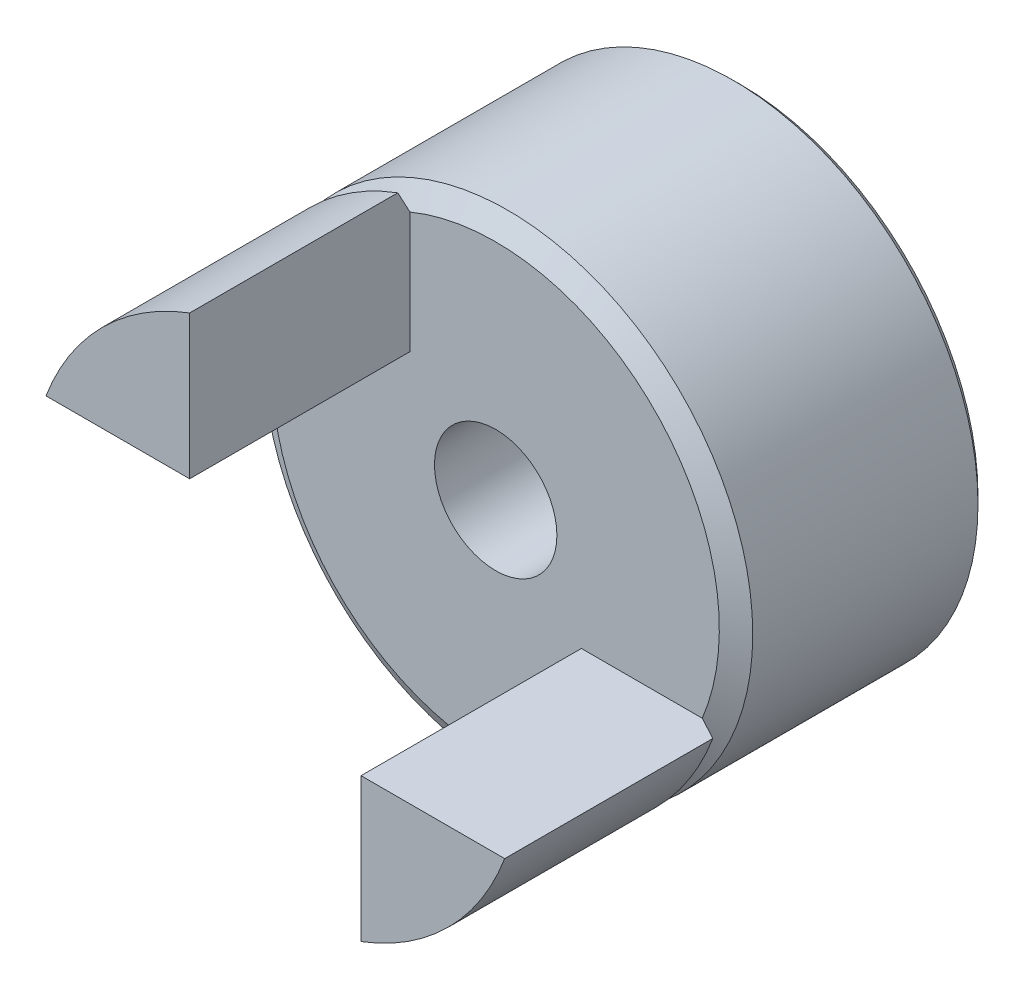
ISO-10303-21;
HEADER;
FILE_DESCRIPTION(('STEP AP214'),'2;1');
FILE_NAME('part.step','',(''),(''),'','','');
FILE_SCHEMA(('AUTOMOTIVE_DESIGN { 1 0 10303 214 1 1 1 1 }'));
ENDSEC;
DATA;
#1=APPLICATION_CONTEXT('core data for automotive mechanical design processes');
#2=APPLICATION_PROTOCOL_DEFINITION('international standard','automotive_design',2000,#1);
#3=PRODUCT_CONTEXT('',#1,'mechanical');
#4=PRODUCT('Part','Part','',(#3));
#5=PRODUCT_RELATED_PRODUCT_CATEGORY('part','',(#4));
#6=PRODUCT_DEFINITION_FORMATION('','',#4);
#7=PRODUCT_DEFINITION_CONTEXT('part definition',#1,'design');
#8=PRODUCT_DEFINITION('design','',#6,#7);
#9=PRODUCT_DEFINITION_SHAPE('','',#8);
#10=(LENGTH_UNIT() NAMED_UNIT(*) SI_UNIT(.MILLI.,.METRE.));
#11=(NAMED_UNIT(*) PLANE_ANGLE_UNIT() SI_UNIT($,.RADIAN.));
#12=(NAMED_UNIT(*) SI_UNIT($,.STERADIAN.) SOLID_ANGLE_UNIT());
#13=UNCERTAINTY_MEASURE_WITH_UNIT(LENGTH_MEASURE(1.E-05),#10,'distance_accuracy_value','');
#14=(GEOMETRIC_REPRESENTATION_CONTEXT(3) GLOBAL_UNCERTAINTY_ASSIGNED_CONTEXT((#13)) GLOBAL_UNIT_ASSIGNED_CONTEXT((#10,
#11,#12)) REPRESENTATION_CONTEXT('',''));
#15=CARTESIAN_POINT('',(0.,0.,0.));
#16=DIRECTION('',(0.,0.,1.));
#17=DIRECTION('',(1.,0.,0.));
#18=AXIS2_PLACEMENT_3D('',#15,#16,#17);
#19=CARTESIAN_POINT('',(0.,0.,10.));
#20=DIRECTION('',(0.,0.,1.));
#21=DIRECTION('',(1.,0.,0.));
#22=AXIS2_PLACEMENT_3D('',#19,#20,#21);
#23=PLANE('',#22);
#24=CARTESIAN_POINT('',(0.,0.,10.));
#25=DIRECTION('',(0.,0.,1.));
#26=DIRECTION('',(1.,0.,0.));
#27=AXIS2_PLACEMENT_3D('',#24,#25,#26);
#28=CIRCLE('',#27,2.5);
#29=CARTESIAN_POINT('',(2.5,0.,10.));
#30=VERTEX_POINT('',#29);
#31=EDGE_CURVE('E219',#30,#30,#28,.T.);
#32=ORIENTED_EDGE('',*,*,#31,.F.);
#33=EDGE_LOOP('',(#32));
#34=FACE_BOUND('',#33,.T.);
#35=DIRECTION('',(1.,0.,0.));
#36=VECTOR('',#35,1.);
#37=CARTESIAN_POINT('',(0.,3.5,10.));
#38=LINE('',#37,#36);
#39=CARTESIAN_POINT('',(-8.43679393634283,3.5,10.));
#40=VERTEX_POINT('',#39);
#41=CARTESIAN_POINT('',(-3.5,3.5,10.));
#42=VERTEX_POINT('',#41);
#43=EDGE_CURVE('E38',#40,#42,#38,.T.);
#44=ORIENTED_EDGE('',*,*,#43,.F.);
#45=CARTESIAN_POINT('',(0.,0.,10.));
#46=DIRECTION('',(0.,0.,-1.));
#47=DIRECTION('',(-1.,0.,0.));
#48=AXIS2_PLACEMENT_3D('',#45,#46,#47);
#49=CIRCLE('',#48,9.13397459621556);
#50=CARTESIAN_POINT('',(3.5,-8.43679393634283,10.));
#51=VERTEX_POINT('',#50);
#52=EDGE_CURVE('E125',#51,#40,#49,.T.);
#53=ORIENTED_EDGE('',*,*,#52,.F.);
#54=DIRECTION('',(0.,1.,0.));
#55=VECTOR('',#54,1.);
#56=CARTESIAN_POINT('',(3.5,0.,10.));
#57=LINE('',#56,#55);
#58=CARTESIAN_POINT('',(3.5,-3.5,10.));
#59=VERTEX_POINT('',#58);
#60=EDGE_CURVE('E59',#51,#59,#57,.T.);
#61=ORIENTED_EDGE('',*,*,#60,.T.);
#62=DIRECTION('',(1.,0.,0.));
#63=VECTOR('',#62,1.);
#64=CARTESIAN_POINT('',(0.,-3.5,10.));
#65=LINE('',#64,#63);
#66=CARTESIAN_POINT('',(8.43679393634283,-3.5,10.));
#67=VERTEX_POINT('',#66);
#68=EDGE_CURVE('E251',#59,#67,#65,.T.);
#69=ORIENTED_EDGE('',*,*,#68,.T.);
#70=CARTESIAN_POINT('',(-3.5,8.43679393634283,10.));
#71=VERTEX_POINT('',#70);
#72=EDGE_CURVE('E51',#71,#67,#49,.T.);
#73=ORIENTED_EDGE('',*,*,#72,.F.);
#74=DIRECTION('',(0.,1.,0.));
#75=VECTOR('',#74,1.);
#76=CARTESIAN_POINT('',(-3.5,0.,10.));
#77=LINE('',#76,#75);
#78=EDGE_CURVE('E225',#42,#71,#77,.T.);
#79=ORIENTED_EDGE('',*,*,#78,.F.);
#80=EDGE_LOOP('',(#44,#53,#61,#69,#73,#79));
#81=FACE_BOUND('',#80,.T.);
#82=ADVANCED_FACE('F34',(#34,#81),#23,.T.);
#83=CARTESIAN_POINT('',(0.,0.,10.));
#84=DIRECTION('',(0.,0.,-1.));
#85=DIRECTION('',(-1.,0.,0.));
#86=AXIS2_PLACEMENT_3D('',#83,#84,#85);
#87=CYLINDRICAL_SURFACE('',#86,10.);
#88=CARTESIAN_POINT('',(0.,0.,0.299999999999995));
#89=DIRECTION('',(0.,0.,1.));
#90=DIRECTION('',(1.,0.,0.));
#91=AXIS2_PLACEMENT_3D('',#88,#89,#90);
#92=CIRCLE('',#91,10.);
#93=CARTESIAN_POINT('',(10.,0.,0.299999999999995));
#94=VERTEX_POINT('',#93);
#95=EDGE_CURVE('E44',#94,#94,#92,.T.);
#96=ORIENTED_EDGE('',*,*,#95,.T.);
#97=EDGE_LOOP('',(#96));
#98=FACE_BOUND('',#97,.T.);
#99=CARTESIAN_POINT('',(0.,0.,9.5));
#100=DIRECTION('',(0.,0.,-1.));
#101=DIRECTION('',(-1.,0.,0.));
#102=AXIS2_PLACEMENT_3D('',#99,#100,#101);
#103=CIRCLE('',#102,10.);
#104=CARTESIAN_POINT('',(-10.,0.,9.5));
#105=VERTEX_POINT('',#104);
#106=EDGE_CURVE('E254',#105,#105,#103,.T.);
#107=ORIENTED_EDGE('',*,*,#106,.T.);
#108=EDGE_LOOP('',(#107));
#109=FACE_BOUND('',#108,.T.);
#110=ADVANCED_FACE('F194',(#98,#109),#87,.T.);
#111=CARTESIAN_POINT('',(0.,0.,10.5));
#112=DIRECTION('',(0.,0.,-1.));
#113=DIRECTION('',(-1.,0.,0.));
#114=AXIS2_PLACEMENT_3D('',#111,#112,#113);
#115=CIRCLE('',#114,10.);
#116=CARTESIAN_POINT('',(9.3674969975976,-3.5,10.5));
#117=VERTEX_POINT('',#116);
#118=CARTESIAN_POINT('',(3.5,-9.3674969975976,10.5));
#119=VERTEX_POINT('',#118);
#120=EDGE_CURVE('E126',#117,#119,#115,.T.);
#121=ORIENTED_EDGE('',*,*,#120,.F.);
#122=DIRECTION('',(0.,0.,-1.));
#123=VECTOR('',#122,1.);
#124=CARTESIAN_POINT('',(9.3674969975976,-3.5,19.));
#125=LINE('',#124,#123);
#126=CARTESIAN_POINT('',(9.3674969975976,-3.5,19.));
#127=VERTEX_POINT('',#126);
#128=EDGE_CURVE('E238',#127,#117,#125,.T.);
#129=ORIENTED_EDGE('',*,*,#128,.F.);
#130=CARTESIAN_POINT('',(0.,0.,19.));
#131=DIRECTION('',(0.,0.,1.));
#132=DIRECTION('',(1.,0.,0.));
#133=AXIS2_PLACEMENT_3D('',#130,#131,#132);
#134=CIRCLE('',#133,10.);
#135=CARTESIAN_POINT('',(3.5,-9.3674969975976,19.));
#136=VERTEX_POINT('',#135);
#137=EDGE_CURVE('E269',#136,#127,#134,.T.);
#138=ORIENTED_EDGE('',*,*,#137,.F.);
#139=DIRECTION('',(0.,0.,-1.));
#140=VECTOR('',#139,1.);
#141=CARTESIAN_POINT('',(3.5,-9.3674969975976,19.));
#142=LINE('',#141,#140);
#143=EDGE_CURVE('E236',#136,#119,#142,.T.);
#144=ORIENTED_EDGE('',*,*,#143,.T.);
#145=EDGE_LOOP('',(#121,#129,#138,#144));
#146=FACE_BOUND('',#145,.T.);
#147=ADVANCED_FACE('F200',(#146),#87,.T.);
#148=CARTESIAN_POINT('',(-9.3674969975976,3.5,10.5));
#149=VERTEX_POINT('',#148);
#150=CARTESIAN_POINT('',(-3.5,9.36749699759759,10.5));
#151=VERTEX_POINT('',#150);
#152=EDGE_CURVE('E108',#149,#151,#115,.T.);
#153=ORIENTED_EDGE('',*,*,#152,.F.);
#154=DIRECTION('',(0.,0.,-1.));
#155=VECTOR('',#154,1.);
#156=CARTESIAN_POINT('',(-9.3674969975976,3.5,19.));
#157=LINE('',#156,#155);
#158=CARTESIAN_POINT('',(-9.3674969975976,3.5,19.));
#159=VERTEX_POINT('',#158);
#160=EDGE_CURVE('E121',#159,#149,#157,.T.);
#161=ORIENTED_EDGE('',*,*,#160,.F.);
#162=CARTESIAN_POINT('',(0.,0.,19.));
#163=DIRECTION('',(0.,0.,1.));
#164=DIRECTION('',(1.,0.,0.));
#165=AXIS2_PLACEMENT_3D('',#162,#163,#164);
#166=CIRCLE('',#165,10.);
#167=CARTESIAN_POINT('',(-3.5,9.3674969975976,19.));
#168=VERTEX_POINT('',#167);
#169=EDGE_CURVE('E132',#168,#159,#166,.T.);
#170=ORIENTED_EDGE('',*,*,#169,.F.);
#171=DIRECTION('',(0.,0.,-1.));
#172=VECTOR('',#171,1.);
#173=CARTESIAN_POINT('',(-3.5,9.3674969975976,19.));
#174=LINE('',#173,#172);
#175=EDGE_CURVE('E124',#168,#151,#174,.T.);
#176=ORIENTED_EDGE('',*,*,#175,.T.);
#177=EDGE_LOOP('',(#153,#161,#170,#176));
#178=FACE_BOUND('',#177,.T.);
#179=ADVANCED_FACE('F119',(#178),#87,.T.);
#180=CARTESIAN_POINT('',(0.,3.5,19.));
#181=DIRECTION('',(0.,1.,0.));
#182=DIRECTION('',(0.,0.,1.));
#183=AXIS2_PLACEMENT_3D('',#180,#181,#182);
#184=PLANE('',#183);
#185=CARTESIAN_POINT('',(0.0335271971686652,3.5,6.74731596011501));
#186=CARTESIAN_POINT('',(-0.0668375018208296,3.5,6.74673409774683));
#187=CARTESIAN_POINT('',(-0.167208233798262,3.5,6.74869724875467));
#188=CARTESIAN_POINT('',(-0.367696321437432,3.5,6.75753158287431));
#189=CARTESIAN_POINT('',(-0.467813759446565,3.5,6.76440088515545));
#190=CARTESIAN_POINT('',(-0.667197524888338,3.5,6.78282750847821));
#191=CARTESIAN_POINT('',(-0.766465658892408,3.5,6.79436549439625));
#192=CARTESIAN_POINT('',(-0.964402099813783,3.5,6.82179711419414));
#193=CARTESIAN_POINT('',(-1.06307035393674,3.5,6.8376911259264));
#194=CARTESIAN_POINT('',(-1.25857949539543,3.5,6.87323949416887));
#195=CARTESIAN_POINT('',(-1.35542846991008,3.5,6.89284971548486));
#196=CARTESIAN_POINT('',(-1.54835563398058,3.5,6.93552915515548));
#197=CARTESIAN_POINT('',(-1.64443382889266,3.5,6.95859834945135));
#198=CARTESIAN_POINT('',(-1.835899700324,3.5,7.00781040167532));
#199=CARTESIAN_POINT('',(-1.9312865778452,3.5,7.0339563526648));
#200=CARTESIAN_POINT('',(-2.12127842419917,3.5,7.08891631667661));
#201=CARTESIAN_POINT('',(-2.21588343372643,3.5,7.11773018987476));
#202=CARTESIAN_POINT('',(-2.50824400482241,3.5,7.21070608349793));
#203=CARTESIAN_POINT('',(-2.70474518571076,3.5,7.27882003354779));
#204=CARTESIAN_POINT('',(-3.094993726335,3.5,7.42257025677505));
#205=CARTESIAN_POINT('',(-3.28874025486641,3.5,7.49820874761193));
#206=CARTESIAN_POINT('',(-3.67414886671948,3.5,7.65513161614566));
#207=CARTESIAN_POINT('',(-3.8658086411767,3.5,7.73642163219215));
#208=CARTESIAN_POINT('',(-4.24726971477068,3.5,7.90317249169705));
#209=CARTESIAN_POINT('',(-4.43707120931096,3.5,7.98863289084733));
#210=CARTESIAN_POINT('',(-4.8157182055926,3.5,8.16297132922256));
#211=CARTESIAN_POINT('',(-5.00455970828207,3.5,8.25185802402439));
#212=CARTESIAN_POINT('',(-5.38105632661693,3.5,8.43211210097172));
#213=CARTESIAN_POINT('',(-5.56871141719806,3.5,8.5234795353111));
#214=CARTESIAN_POINT('',(-6.13003313013939,3.5,8.80036664210018));
#215=CARTESIAN_POINT('',(-6.50227411774885,3.5,8.98877309153701));
#216=CARTESIAN_POINT('',(-7.2497495182192,3.5,9.37335832316995));
#217=CARTESIAN_POINT('',(-7.62494555466536,3.5,9.56961117435592));
#218=CARTESIAN_POINT('',(-8.37356373583642,3.5,9.96558392130251));
#219=CARTESIAN_POINT('',(-8.74698564104083,3.5,10.1653042691585));
#220=CARTESIAN_POINT('',(-9.49199244541637,3.5,10.5668794644709));
#221=CARTESIAN_POINT('',(-9.86357920111912,3.5,10.7687308749107));
#222=CARTESIAN_POINT('',(-10.6057909450581,3.5,11.1741945414932));
#223=CARTESIAN_POINT('',(-10.976415931395,3.5,11.3778068011098));
#224=CARTESIAN_POINT('',(-11.476726900897,3.5,11.6538297981879));
#225=CARTESIAN_POINT('',(-11.6067330969078,3.5,11.7256610111123));
#226=CARTESIAN_POINT('',(-11.8666850799375,3.5,11.8694852672155));
#227=CARTESIAN_POINT('',(-11.9966308527804,3.5,11.941478336025));
#228=CARTESIAN_POINT('',(-12.255705560692,3.5,12.0851891353176));
#229=CARTESIAN_POINT('',(-12.3848349249686,3.5,12.156906092213));
#230=CARTESIAN_POINT('',(-12.6430029880758,3.5,12.30045089632));
#231=CARTESIAN_POINT('',(-12.7720416986648,3.5,12.3722787223829));
#232=CARTESIAN_POINT('',(-12.9010491947663,3.5,12.4441625493059));
#233=B_SPLINE_CURVE_WITH_KNOTS('',3,(#185,#186,#187,#188,#189,#190,#191,#192,#193,#194,#195,
#196,#197,#198,#199,#200,#201,#202,#203,#204,#205,#206,#207,#208,#209,#210,#211,#212,#213,#214,
#215,#216,#217,#218,#219,#220,#221,#222,#223,#224,#225,#226,#227,#228,#229,#230,#231,#232),
.UNSPECIFIED.,.F.,.F.,(4,2,2,2,2,2,2,2,2,2,2,2,2,2,2,2,2,2,2,2,2,2,2,4),(0.,0.30105454503711,
0.601993739188417,0.901699160429758,1.20143058708981,1.49780315864791,1.79417366889369,
2.09084470726875,2.387500206086,3.01117586329075,3.63503588006326,4.25952749041464,
4.88395271274112,5.51007465170351,6.13620977427031,7.3877583767549,8.65800706425606,
9.92842263054628,11.1970326499085,12.4656451725296,12.9112368870873,13.3569049868657,
13.8000295444863,14.2430780355783),.UNSPECIFIED.);
#234=EDGE_CURVE('E105',#40,#149,#233,.T.);
#235=ORIENTED_EDGE('',*,*,#234,.F.);
#236=ORIENTED_EDGE('',*,*,#43,.T.);
#237=DIRECTION('',(0.,0.,-1.));
#238=VECTOR('',#237,1.);
#239=CARTESIAN_POINT('',(-3.5,3.5,19.));
#240=LINE('',#239,#238);
#241=CARTESIAN_POINT('',(-3.5,3.5,19.));
#242=VERTEX_POINT('',#241);
#243=EDGE_CURVE('E134',#242,#42,#240,.T.);
#244=ORIENTED_EDGE('',*,*,#243,.F.);
#245=DIRECTION('',(1.,0.,0.));
#246=VECTOR('',#245,1.);
#247=CARTESIAN_POINT('',(0.,3.5,19.));
#248=LINE('',#247,#246);
#249=EDGE_CURVE('E131',#159,#242,#248,.T.);
#250=ORIENTED_EDGE('',*,*,#249,.F.);
#251=ORIENTED_EDGE('',*,*,#160,.T.);
#252=EDGE_LOOP('',(#235,#236,#244,#250,#251));
#253=FACE_BOUND('',#252,.T.);
#254=ADVANCED_FACE('F128',(#253),#184,.F.);
#255=CARTESIAN_POINT('',(-3.5,0.,19.));
#256=DIRECTION('',(-1.,0.,0.));
#257=DIRECTION('',(0.,0.,1.));
#258=AXIS2_PLACEMENT_3D('',#255,#256,#257);
#259=PLANE('',#258);
#260=CARTESIAN_POINT('',(-3.5,12.9010491947663,12.4441625493059));
#261=CARTESIAN_POINT('',(-3.5,12.5680867000781,12.2586491772017));
#262=CARTESIAN_POINT('',(-3.5,12.2349273148496,12.0734875620625));
#263=CARTESIAN_POINT('',(-3.5,11.5680728857833,11.7041108129314));
#264=CARTESIAN_POINT('',(-3.5,11.2343778279841,11.519895704152));
#265=CARTESIAN_POINT('',(-3.5,10.5658713126068,11.1524138546853));
#266=CARTESIAN_POINT('',(-3.5,10.2310589525529,10.9691487541575));
#267=CARTESIAN_POINT('',(-3.5,9.56058025182923,10.6042004002696));
#268=CARTESIAN_POINT('',(-3.5,9.22491392632185,10.4225171190738));
#269=CARTESIAN_POINT('',(-3.5,8.52861300129965,10.048457248276));
#270=CARTESIAN_POINT('',(-3.5,8.16789503574098,9.85623549325133));
#271=CARTESIAN_POINT('',(-3.5,7.44463232841988,9.47520385031002));
#272=CARTESIAN_POINT('',(-3.5,7.08208748288518,9.28639415906755));
#273=CARTESIAN_POINT('',(-3.5,6.35468234190206,8.91391973592338));
#274=CARTESIAN_POINT('',(-3.5,5.98982394673394,8.73025132008726));
#275=CARTESIAN_POINT('',(-3.5,5.43967975028417,8.46061302340093));
#276=CARTESIAN_POINT('',(-3.5,5.25583059956079,8.37171485272413));
#277=CARTESIAN_POINT('',(-3.5,4.88694339879431,8.1964247464143));
#278=CARTESIAN_POINT('',(-3.5,4.70190538358925,8.11003273774707));
#279=CARTESIAN_POINT('',(-3.5,4.37440401781308,7.96058107360478));
#280=CARTESIAN_POINT('',(-3.5,4.23224918744295,7.89684627819677));
#281=CARTESIAN_POINT('',(-3.5,3.94692004976902,7.77168825584133));
#282=CARTESIAN_POINT('',(-3.5,3.80374572879724,7.7102650599544));
#283=CARTESIAN_POINT('',(-3.5,3.51607350651577,7.59022912512891));
#284=CARTESIAN_POINT('',(-3.5,3.37157456549036,7.53161886846925));
#285=CARTESIAN_POINT('',(-3.5,3.08117120511449,7.41797857675549));
#286=CARTESIAN_POINT('',(-3.5,2.93526681152193,7.36294847623026));
#287=CARTESIAN_POINT('',(-3.5,2.64437768373464,7.25829628707925));
#288=CARTESIAN_POINT('',(-3.5,2.49942092956177,7.20859692156962));
#289=CARTESIAN_POINT('',(-3.5,2.20772689165874,7.11462152970015));
#290=CARTESIAN_POINT('',(-3.5,2.06098942533396,7.0703460647619));
#291=CARTESIAN_POINT('',(-3.5,1.76586542073207,6.98861634439367));
#292=CARTESIAN_POINT('',(-3.5,1.61748195267952,6.951151111979));
#293=CARTESIAN_POINT('',(-3.5,1.31889401620262,6.88447223600032));
#294=CARTESIAN_POINT('',(-3.5,1.168690294319,6.8552553215401));
#295=CARTESIAN_POINT('',(-3.5,0.931187469512068,6.81696776834379));
#296=CARTESIAN_POINT('',(-3.5,0.844410707488042,6.80462147544605));
#297=CARTESIAN_POINT('',(-3.5,0.670428171540512,6.78337563286994));
#298=CARTESIAN_POINT('',(-3.5,0.583222382812669,6.77447620298865));
#299=CARTESIAN_POINT('',(-3.5,0.407839957627205,6.76027474878846));
#300=CARTESIAN_POINT('',(-3.5,0.319661017984115,6.75500097129317));
#301=CARTESIAN_POINT('',(-3.5,0.143143537197677,6.74826886348073));
#302=CARTESIAN_POINT('',(-3.5,0.0548049717759209,6.74681117296035));
#303=CARTESIAN_POINT('',(-3.5,-0.0335271971686652,6.74731596011501));
#304=B_SPLINE_CURVE_WITH_KNOTS('',3,(#260,#261,#262,#263,#264,#265,#266,#267,#268,#269,#270,
#271,#272,#273,#274,#275,#276,#277,#278,#279,#280,#281,#282,#283,#284,#285,#286,#287,#288,#289,
#290,#291,#292,#293,#294,#295,#296,#297,#298,#299,#300,#301,#302,#303),.UNSPECIFIED.,.F.,.F.,(4,
2,2,2,2,2,2,2,2,2,2,2,2,2,2,2,2,2,2,2,2,4),(0.,1.1434663553326,2.28696301340616,3.4320224372984,
4.57706167041126,5.8032615978421,7.02953198043759,8.25489994851591,8.86752872414971,
9.48013962867457,9.94748963524885,10.4148459192717,10.8826073117231,11.3503601477092,
11.8099957102485,12.2696788089975,12.7286142732355,13.1873674887247,13.4502603227313,
13.7131622928617,13.9780899565386,14.2430620345634),.UNSPECIFIED.);
#305=EDGE_CURVE('E114',#151,#71,#304,.T.);
#306=ORIENTED_EDGE('',*,*,#305,.F.);
#307=ORIENTED_EDGE('',*,*,#175,.F.);
#308=DIRECTION('',(0.,1.,0.));
#309=VECTOR('',#308,1.);
#310=CARTESIAN_POINT('',(-3.5,0.,19.));
#311=LINE('',#310,#309);
#312=EDGE_CURVE('E136',#242,#168,#311,.T.);
#313=ORIENTED_EDGE('',*,*,#312,.F.);
#314=ORIENTED_EDGE('',*,*,#243,.T.);
#315=ORIENTED_EDGE('',*,*,#78,.T.);
#316=EDGE_LOOP('',(#306,#307,#313,#314,#315));
#317=FACE_BOUND('',#316,.T.);
#318=ADVANCED_FACE('F176',(#317),#259,.F.);
#319=CARTESIAN_POINT('',(3.5,0.,19.));
#320=DIRECTION('',(-1.,0.,0.));
#321=DIRECTION('',(0.,0.,1.));
#322=AXIS2_PLACEMENT_3D('',#319,#320,#321);
#323=PLANE('',#322);
#324=ORIENTED_EDGE('',*,*,#60,.F.);
#325=CARTESIAN_POINT('',(3.5,0.0334573591593998,6.74731557429212));
#326=CARTESIAN_POINT('',(3.5,-0.0669089186267847,6.74673485853601));
#327=CARTESIAN_POINT('',(3.5,-0.167281198250569,6.74869923783571));
#328=CARTESIAN_POINT('',(3.5,-0.367772311296723,6.7575361471907));
#329=CARTESIAN_POINT('',(3.5,-0.467891227101125,6.76440679614477));
#330=CARTESIAN_POINT('',(3.5,-0.667277862653203,6.78283618084975));
#331=CARTESIAN_POINT('',(3.5,-0.766547389301716,6.79437558057998));
#332=CARTESIAN_POINT('',(3.5,-0.964486557555642,6.82181006036837));
#333=CARTESIAN_POINT('',(3.5,-1.06315614635288,6.83770551834372));
#334=CARTESIAN_POINT('',(3.5,-1.2586679552332,6.87325677331333));
#335=CARTESIAN_POINT('',(3.5,-1.35551826258979,6.89286843757559));
#336=CARTESIAN_POINT('',(3.5,-1.54844805504017,6.93555074369747));
#337=CARTESIAN_POINT('',(3.5,-1.644527545494,6.95862136148253));
#338=CARTESIAN_POINT('',(3.5,-1.83599599038074,7.00783622931742));
#339=CARTESIAN_POINT('',(3.5,-1.9313841457357,7.03398357260279));
#340=CARTESIAN_POINT('',(3.5,-2.12137853150632,7.08894627926111));
#341=CARTESIAN_POINT('',(3.5,-2.21598480261838,7.11776150280832));
#342=CARTESIAN_POINT('',(3.5,-2.5083584757156,7.21074443913791));
#343=CARTESIAN_POINT('',(3.5,-2.70487133284827,7.27886447592276));
#344=CARTESIAN_POINT('',(3.5,-3.09514300323454,7.42262726825995));
#345=CARTESIAN_POINT('',(3.5,-3.28890098518045,7.49827224168294));
#346=CARTESIAN_POINT('',(3.5,-3.67433237956518,7.65520828648127));
#347=CARTESIAN_POINT('',(3.5,-3.86600348295454,7.73650499651854));
#348=CARTESIAN_POINT('',(3.5,-4.24748712928423,7.90326933966407));
#349=CARTESIAN_POINT('',(3.5,-4.43729986764995,7.98873652842409));
#350=CARTESIAN_POINT('',(3.5,-4.81596932046877,8.16308859731059));
#351=CARTESIAN_POINT('',(3.5,-5.00482203586589,8.25198213286028));
#352=CARTESIAN_POINT('',(3.5,-5.38134105616782,8.43224990110808));
#353=CARTESIAN_POINT('',(3.5,-5.56900733600576,8.52362418600469));
#354=CARTESIAN_POINT('',(3.5,-6.13036258356939,8.80053182287959));
#355=CARTESIAN_POINT('',(3.5,-6.50262590152716,8.98895194060899));
#356=CARTESIAN_POINT('',(3.5,-7.25014570191986,9.37356432711928));
#357=CARTESIAN_POINT('',(3.5,-7.62536381232196,9.5698306556295));
#358=CARTESIAN_POINT('',(3.5,-8.37402617582539,9.96583027457252));
#359=CARTESIAN_POINT('',(3.5,-8.7474701894002,10.1655640171082));
#360=CARTESIAN_POINT('',(3.5,-9.49252124709421,10.5671659299901));
#361=CARTESIAN_POINT('',(3.5,-9.86413014757001,10.7690306636676));
#362=CARTESIAN_POINT('',(3.5,-10.6063862078538,11.1745209171372));
#363=CARTESIAN_POINT('',(3.5,-10.9770333657632,11.3781464404016));
#364=CARTESIAN_POINT('',(3.5,-11.4773047781432,11.654148964845));
#365=CARTESIAN_POINT('',(3.5,-11.6072492831916,11.7259463761291));
#366=CARTESIAN_POINT('',(3.5,-11.8670779503029,11.8697028596252));
#367=CARTESIAN_POINT('',(3.5,-11.9969620982113,11.9416619574291));
#368=CARTESIAN_POINT('',(3.5,-12.255914390591,12.0853050975068));
#369=CARTESIAN_POINT('',(3.5,-12.3849829636031,12.1569883673966));
#370=CARTESIAN_POINT('',(3.5,-12.6430295308325,12.3004656905922));
#371=CARTESIAN_POINT('',(3.5,-12.7720075367914,12.3722597227795));
#372=CARTESIAN_POINT('',(3.5,-12.900954356757,12.4441097047613));
#373=B_SPLINE_CURVE_WITH_KNOTS('',3,(#325,#326,#327,#328,#329,#330,#331,#332,#333,#334,#335,
#336,#337,#338,#339,#340,#341,#342,#343,#344,#345,#346,#347,#348,#349,#350,#351,#352,#353,#354,
#355,#356,#357,#358,#359,#360,#361,#362,#363,#364,#365,#366,#367,#368,#369,#370,#371,#372),
.UNSPECIFIED.,.F.,.F.,(4,2,2,2,2,2,2,2,2,2,2,2,2,2,2,2,2,2,2,2,2,2,2,4),(0.,0.301059256489437,
0.60200314649575,0.901713206565488,1.20144927672442,1.49782662754899,1.7942019156613,
2.09087775705897,2.38753805823258,3.01125277418414,3.63515186914811,4.25968260920664,
4.88414695262968,5.51030806762499,6.13648236816566,7.38810926416637,8.65843537322074,
9.92892837814733,11.1976158544953,12.4663058333936,12.9116865163723,13.3571435126515,
13.8000595673964,14.2428996270669),.UNSPECIFIED.);
#374=EDGE_CURVE('E161',#51,#119,#373,.T.);
#375=ORIENTED_EDGE('',*,*,#374,.T.);
#376=ORIENTED_EDGE('',*,*,#143,.F.);
#377=DIRECTION('',(0.,1.,0.));
#378=VECTOR('',#377,1.);
#379=CARTESIAN_POINT('',(3.5,0.,19.));
#380=LINE('',#379,#378);
#381=CARTESIAN_POINT('',(3.5,-3.5,19.));
#382=VERTEX_POINT('',#381);
#383=EDGE_CURVE('E263',#136,#382,#380,.T.);
#384=ORIENTED_EDGE('',*,*,#383,.T.);
#385=DIRECTION('',(0.,0.,-1.));
#386=VECTOR('',#385,1.);
#387=CARTESIAN_POINT('',(3.5,-3.5,19.));
#388=LINE('',#387,#386);
#389=EDGE_CURVE('E244',#382,#59,#388,.T.);
#390=ORIENTED_EDGE('',*,*,#389,.T.);
#391=EDGE_LOOP('',(#324,#375,#376,#384,#390));
#392=FACE_BOUND('',#391,.T.);
#393=ADVANCED_FACE('F180',(#392),#323,.T.);
#394=CARTESIAN_POINT('',(0.,-3.5,19.));
#395=DIRECTION('',(0.,1.,0.));
#396=DIRECTION('',(0.,0.,1.));
#397=AXIS2_PLACEMENT_3D('',#394,#395,#396);
#398=PLANE('',#397);
#399=ORIENTED_EDGE('',*,*,#128,.T.);
#400=CARTESIAN_POINT('',(12.900954356757,-3.5,12.4441097047613));
#401=CARTESIAN_POINT('',(12.5679895860019,-3.5,12.2585951589753));
#402=CARTESIAN_POINT('',(12.2348279183983,-3.5,12.0734323815259));
#403=CARTESIAN_POINT('',(11.5679689035894,-3.5,11.7040533429922));
#404=CARTESIAN_POINT('',(11.2342715424201,-3.5,11.5198371071254));
#405=CARTESIAN_POINT('',(10.5657603346317,-3.5,11.1523530204834));
#406=CARTESIAN_POINT('',(10.2309455853898,-3.5,10.9690868101364));
#407=CARTESIAN_POINT('',(9.56046206903006,-3.5,10.6041363097396));
#408=CARTESIAN_POINT('',(9.22479331707806,-3.5,10.4224519918477));
#409=CARTESIAN_POINT('',(8.52848591860914,-3.5,10.0483893381673));
#410=CARTESIAN_POINT('',(8.16776389691648,-3.5,9.85616585417569));
#411=CARTESIAN_POINT('',(7.44449295775521,-3.5,9.47513097941253));
#412=CARTESIAN_POINT('',(7.08194393648786,-3.5,9.28631978536582));
#413=CARTESIAN_POINT('',(6.35453028842514,-3.5,8.91384275285036));
#414=CARTESIAN_POINT('',(5.98966756224297,-3.5,8.73017322978722));
#415=CARTESIAN_POINT('',(5.43951664027799,-3.5,8.46053379330484));
#416=CARTESIAN_POINT('',(5.25566521126307,-3.5,8.37163533028277));
#417=CARTESIAN_POINT('',(4.88677335249785,-3.5,8.19634488024932));
#418=CARTESIAN_POINT('',(4.7017329575955,-3.5,8.10995282018225));
#419=CARTESIAN_POINT('',(4.37423110979534,-3.5,7.96050310818939));
#420=CARTESIAN_POINT('',(4.23207822784239,-3.5,7.89677019549535));
#421=CARTESIAN_POINT('',(3.94675295326399,-3.5,7.77161605461905));
#422=CARTESIAN_POINT('',(3.80358054696873,-3.5,7.71019485750199));
#423=CARTESIAN_POINT('',(3.51591211776992,-3.5,7.5901630635212));
#424=CARTESIAN_POINT('',(3.37141505509313,-3.5,7.53155494912586));
#425=CARTESIAN_POINT('',(3.08101541923338,-3.5,7.41791911687007));
#426=CARTESIAN_POINT('',(2.93511287180923,-3.5,7.36289133353445));
#427=CARTESIAN_POINT('',(2.64422736061042,-3.5,7.25824393751467));
#428=CARTESIAN_POINT('',(2.49927237699643,-3.5,7.20854704501702));
#429=CARTESIAN_POINT('',(2.20758187989919,-3.5,7.11457683010691));
#430=CARTESIAN_POINT('',(2.06084618381995,-3.5,7.07030406914403));
#431=CARTESIAN_POINT('',(1.7657257724673,-3.5,6.98857999619389));
#432=CARTESIAN_POINT('',(1.61734412755259,-3.5,6.95111770611995));
#433=CARTESIAN_POINT('',(1.31875993756777,-3.5,6.88444491877215));
#434=CARTESIAN_POINT('',(1.16855813904831,-3.5,6.85523115030853));
#435=CARTESIAN_POINT('',(0.931073528477519,-3.5,6.81695104587167));
#436=CARTESIAN_POINT('',(0.844313084899505,-3.5,6.80460846680027));
#437=CARTESIAN_POINT('',(0.67036338097387,-3.5,6.78336880943073));
#438=CARTESIAN_POINT('',(0.583174105815909,-3.5,6.77447185099055));
#439=CARTESIAN_POINT('',(0.407825100036503,-3.5,6.76027399119621));
#440=CARTESIAN_POINT('',(0.319663067704387,-3.5,6.75500132045161));
#441=CARTESIAN_POINT('',(0.143179462451876,-3.5,6.74826996078571));
#442=CARTESIAN_POINT('',(0.054857865284129,-3.5,6.74681191078971));
#443=CARTESIAN_POINT('',(-0.0334573591594003,-3.5,6.74731557429212));
#444=B_SPLINE_CURVE_WITH_KNOTS('',3,(#400,#401,#402,#403,#404,#405,#406,#407,#408,#409,#410,
#411,#412,#413,#414,#415,#416,#417,#418,#419,#420,#421,#422,#423,#424,#425,#426,#427,#428,#429,
#430,#431,#432,#433,#434,#435,#436,#437,#438,#439,#440,#441,#442,#443),.UNSPECIFIED.,.F.,.F.,(4,
2,2,2,2,2,2,2,2,2,2,2,2,2,2,2,2,2,2,2,2,4),(0.,1.14347403400793,2.28697837562583,
3.43204568517428,4.57709280005803,5.80330590399239,7.0295894773142,8.25497053339859,
8.8676058418355,9.48022327543426,9.94756563584489,10.4149142742373,10.8826680251287,
11.3504132195858,11.810041343153,12.2697170025117,12.7286449909004,13.18739072167,
13.4502335520614,13.7130855247752,13.9779624060684,14.2428836497545),.UNSPECIFIED.);
#445=EDGE_CURVE('E11',#117,#67,#444,.T.);
#446=ORIENTED_EDGE('',*,*,#445,.T.);
#447=ORIENTED_EDGE('',*,*,#68,.F.);
#448=ORIENTED_EDGE('',*,*,#389,.F.);
#449=DIRECTION('',(1.,0.,0.));
#450=VECTOR('',#449,1.);
#451=CARTESIAN_POINT('',(0.,-3.5,19.));
#452=LINE('',#451,#450);
#453=EDGE_CURVE('E266',#382,#127,#452,.T.);
#454=ORIENTED_EDGE('',*,*,#453,.T.);
#455=EDGE_LOOP('',(#399,#446,#447,#448,#454));
#456=FACE_BOUND('',#455,.T.);
#457=ADVANCED_FACE('F147',(#456),#398,.T.);
#458=CARTESIAN_POINT('',(0.,0.,0.));
#459=DIRECTION('',(0.,0.,1.));
#460=DIRECTION('',(1.,0.,0.));
#461=AXIS2_PLACEMENT_3D('',#458,#459,#460);
#462=PLANE('',#461);
#463=CARTESIAN_POINT('',(0.,0.,0.));
#464=DIRECTION('',(0.,0.,1.));
#465=DIRECTION('',(1.,0.,0.));
#466=AXIS2_PLACEMENT_3D('',#463,#464,#465);
#467=CIRCLE('',#466,2.8);
#468=CARTESIAN_POINT('',(-2.8,0.,0.));
#469=VERTEX_POINT('',#468);
#470=EDGE_CURVE('E214',#469,#469,#467,.T.);
#471=ORIENTED_EDGE('',*,*,#470,.T.);
#472=EDGE_LOOP('',(#471));
#473=FACE_BOUND('',#472,.T.);
#474=CARTESIAN_POINT('',(0.,0.,0.));
#475=DIRECTION('',(0.,0.,1.));
#476=DIRECTION('',(1.,0.,0.));
#477=AXIS2_PLACEMENT_3D('',#474,#475,#476);
#478=CIRCLE('',#477,9.7);
#479=CARTESIAN_POINT('',(9.7,0.,0.));
#480=VERTEX_POINT('',#479);
#481=EDGE_CURVE('E215',#480,#480,#478,.F.);
#482=ORIENTED_EDGE('',*,*,#481,.T.);
#483=EDGE_LOOP('',(#482));
#484=FACE_BOUND('',#483,.T.);
#485=ADVANCED_FACE('F190',(#473,#484),#462,.F.);
#486=CARTESIAN_POINT('',(0.,0.,10.));
#487=DIRECTION('',(0.,0.,-1.));
#488=DIRECTION('',(-1.,0.,0.));
#489=AXIS2_PLACEMENT_3D('',#486,#487,#488);
#490=CYLINDRICAL_SURFACE('',#489,2.5);
#491=CARTESIAN_POINT('',(0.,0.,0.300000000000005));
#492=DIRECTION('',(0.,0.,1.));
#493=DIRECTION('',(1.,0.,0.));
#494=AXIS2_PLACEMENT_3D('',#491,#492,#493);
#495=CIRCLE('',#494,2.5);
#496=CARTESIAN_POINT('',(-2.5,0.,0.300000000000005));
#497=VERTEX_POINT('',#496);
#498=EDGE_CURVE('E211',#497,#497,#495,.F.);
#499=ORIENTED_EDGE('',*,*,#498,.T.);
#500=EDGE_LOOP('',(#499));
#501=FACE_BOUND('',#500,.T.);
#502=ORIENTED_EDGE('',*,*,#31,.T.);
#503=EDGE_LOOP('',(#502));
#504=FACE_BOUND('',#503,.T.);
#505=ADVANCED_FACE('F186',(#501,#504),#490,.F.);
#506=CARTESIAN_POINT('',(0.,0.,0.));
#507=DIRECTION('',(0.,0.,-1.));
#508=DIRECTION('',(-1.,0.,0.));
#509=AXIS2_PLACEMENT_3D('',#506,#507,#508);
#510=CONICAL_SURFACE('',#509,2.8,0.78539816339744);
#511=CARTESIAN_POINT('',(-2.5,0.,0.300000000000005));
#512=CARTESIAN_POINT('',(-2.503125,0.,0.296875000000005));
#513=CARTESIAN_POINT('',(-2.50625,0.,0.293750000000005));
#514=CARTESIAN_POINT('',(-2.5125,0.,0.287500000000005));
#515=CARTESIAN_POINT('',(-2.515625,0.,0.284375000000005));
#516=CARTESIAN_POINT('',(-2.521875,0.,0.278125000000005));
#517=CARTESIAN_POINT('',(-2.525,0.,0.275000000000005));
#518=CARTESIAN_POINT('',(-2.53125,0.,0.268750000000004));
#519=CARTESIAN_POINT('',(-2.534375,0.,0.265625000000004));
#520=CARTESIAN_POINT('',(-2.540625,0.,0.259375000000004));
#521=CARTESIAN_POINT('',(-2.54375,0.,0.256250000000004));
#522=CARTESIAN_POINT('',(-2.55,0.,0.250000000000004));
#523=CARTESIAN_POINT('',(-2.553125,0.,0.246875000000004));
#524=CARTESIAN_POINT('',(-2.559375,0.,0.240625000000004));
#525=CARTESIAN_POINT('',(-2.5625,0.,0.237500000000004));
#526=CARTESIAN_POINT('',(-2.56875,0.,0.231250000000004));
#527=CARTESIAN_POINT('',(-2.571875,0.,0.228125000000004));
#528=CARTESIAN_POINT('',(-2.578125,0.,0.221875000000004));
#529=CARTESIAN_POINT('',(-2.58125,0.,0.218750000000004));
#530=CARTESIAN_POINT('',(-2.5875,0.,0.212500000000004));
#531=CARTESIAN_POINT('',(-2.590625,0.,0.209375000000004));
#532=CARTESIAN_POINT('',(-2.596875,0.,0.203125000000003));
#533=CARTESIAN_POINT('',(-2.6,0.,0.200000000000003));
#534=CARTESIAN_POINT('',(-2.60625,0.,0.193750000000003));
#535=CARTESIAN_POINT('',(-2.609375,0.,0.190625000000003));
#536=CARTESIAN_POINT('',(-2.615625,0.,0.184375000000003));
#537=CARTESIAN_POINT('',(-2.61875,0.,0.181250000000003));
#538=CARTESIAN_POINT('',(-2.625,0.,0.175000000000003));
#539=CARTESIAN_POINT('',(-2.628125,0.,0.171875000000003));
#540=CARTESIAN_POINT('',(-2.634375,0.,0.165625000000003));
#541=CARTESIAN_POINT('',(-2.6375,0.,0.162500000000003));
#542=CARTESIAN_POINT('',(-2.64375,0.,0.156250000000003));
#543=CARTESIAN_POINT('',(-2.646875,0.,0.153125000000003));
#544=CARTESIAN_POINT('',(-2.653125,0.,0.146875000000003));
#545=CARTESIAN_POINT('',(-2.65625,0.,0.143750000000002));
#546=CARTESIAN_POINT('',(-2.6625,0.,0.137500000000002));
#547=CARTESIAN_POINT('',(-2.665625,0.,0.134375000000002));
#548=CARTESIAN_POINT('',(-2.671875,0.,0.128125000000002));
#549=CARTESIAN_POINT('',(-2.675,0.,0.125000000000002));
#550=CARTESIAN_POINT('',(-2.68125,0.,0.118750000000002));
#551=CARTESIAN_POINT('',(-2.684375,0.,0.115625000000002));
#552=CARTESIAN_POINT('',(-2.690625,0.,0.109375000000002));
#553=CARTESIAN_POINT('',(-2.69375,0.,0.106250000000002));
#554=CARTESIAN_POINT('',(-2.7,0.,0.100000000000002));
#555=CARTESIAN_POINT('',(-2.703125,0.,0.0968750000000017));
#556=CARTESIAN_POINT('',(-2.709375,0.,0.0906250000000015));
#557=CARTESIAN_POINT('',(-2.7125,0.,0.0875000000000014));
#558=CARTESIAN_POINT('',(-2.71875,0.,0.0812500000000013));
#559=CARTESIAN_POINT('',(-2.721875,0.,0.0781250000000014));
#560=CARTESIAN_POINT('',(-2.728125,0.,0.0718750000000012));
#561=CARTESIAN_POINT('',(-2.73125,0.,0.0687500000000011));
#562=CARTESIAN_POINT('',(-2.7375,0.,0.062500000000001));
#563=CARTESIAN_POINT('',(-2.740625,0.,0.059375000000001));
#564=CARTESIAN_POINT('',(-2.746875,0.,0.0531250000000009));
#565=CARTESIAN_POINT('',(-2.75,0.,0.0500000000000009));
#566=CARTESIAN_POINT('',(-2.75625,0.,0.0437500000000007));
#567=CARTESIAN_POINT('',(-2.759375,0.,0.0406250000000006));
#568=CARTESIAN_POINT('',(-2.765625,0.,0.0343750000000006));
#569=CARTESIAN_POINT('',(-2.76875,0.,0.0312500000000006));
#570=CARTESIAN_POINT('',(-2.775,0.,0.0250000000000005));
#571=CARTESIAN_POINT('',(-2.778125,0.,0.0218750000000003));
#572=CARTESIAN_POINT('',(-2.784375,0.,0.0156250000000002));
#573=CARTESIAN_POINT('',(-2.7875,0.,0.0125000000000002));
#574=CARTESIAN_POINT('',(-2.79375,0.,0.00625000000000018));
#575=CARTESIAN_POINT('',(-2.796875,0.,0.00312500000000018));
#576=CARTESIAN_POINT('',(-2.8,0.,0.));
#577=B_SPLINE_CURVE_WITH_KNOTS('',3,(#511,#512,#513,#514,#515,#516,#517,#518,#519,#520,#521,
#522,#523,#524,#525,#526,#527,#528,#529,#530,#531,#532,#533,#534,#535,#536,#537,#538,#539,#540,
#541,#542,#543,#544,#545,#546,#547,#548,#549,#550,#551,#552,#553,#554,#555,#556,#557,#558,#559,
#560,#561,#562,#563,#564,#565,#566,#567,#568,#569,#570,#571,#572,#573,#574,#575,#576),
.UNSPECIFIED.,.F.,.F.,(4,2,2,2,2,2,2,2,2,2,2,2,2,2,2,2,2,2,2,2,2,2,2,2,2,2,2,2,2,2,2,2,4),(0.,
0.0132582521472478,0.0265165042944958,0.0397747564417436,0.0530330085889917,0.0662912607362394,
0.0795495128834872,0.0928077650307352,0.106066017177983,0.119324269325231,0.132582521472479,
0.145840773619727,0.159099025766975,0.172357277914222,0.18561553006147,0.198873782208718,
0.212132034355966,0.225390286503214,0.238648538650462,0.25190679079771,0.265165042944958,
0.278423295092206,0.291681547239454,0.304939799386701,0.318198051533949,0.331456303681197,
0.344714555828445,0.357972807975693,0.371231060122941,0.384489312270189,0.397747564417437,
0.411005816564685,0.424264068711932),.UNSPECIFIED.);
#578=EDGE_CURVE('BSEAM189',#497,#469,#577,.T.);
#579=ORIENTED_EDGE('',*,*,#498,.F.);
#580=ORIENTED_EDGE('',*,*,#470,.F.);
#581=ORIENTED_EDGE('',*,*,#578,.T.);
#582=ORIENTED_EDGE('',*,*,#578,.F.);
#583=EDGE_LOOP('',(#579,#581,#580,#582));
#584=FACE_BOUND('',#583,.T.);
#585=ADVANCED_FACE('F189',(#584),#510,.F.);
#586=CARTESIAN_POINT('',(0.,0.,0.299999999999995));
#587=DIRECTION('',(0.,0.,1.));
#588=DIRECTION('',(1.,0.,0.));
#589=AXIS2_PLACEMENT_3D('',#586,#587,#588);
#590=CONICAL_SURFACE('',#589,10.,0.785398163397451);
#591=ORIENTED_EDGE('',*,*,#481,.F.);
#592=EDGE_LOOP('',(#591));
#593=FACE_BOUND('',#592,.T.);
#594=ORIENTED_EDGE('',*,*,#95,.F.);
#595=EDGE_LOOP('',(#594));
#596=FACE_BOUND('',#595,.T.);
#597=ADVANCED_FACE('F36',(#593,#596),#590,.T.);
#598=CARTESIAN_POINT('',(0.,0.,19.));
#599=DIRECTION('',(0.,0.,1.));
#600=DIRECTION('',(1.,0.,0.));
#601=AXIS2_PLACEMENT_3D('',#598,#599,#600);
#602=PLANE('',#601);
#603=ORIENTED_EDGE('',*,*,#249,.T.);
#604=ORIENTED_EDGE('',*,*,#312,.T.);
#605=ORIENTED_EDGE('',*,*,#169,.T.);
#606=EDGE_LOOP('',(#603,#604,#605));
#607=FACE_BOUND('',#606,.T.);
#608=ADVANCED_FACE('F182',(#607),#602,.T.);
#609=CARTESIAN_POINT('',(0.,0.,19.));
#610=DIRECTION('',(0.,0.,1.));
#611=DIRECTION('',(1.,0.,0.));
#612=AXIS2_PLACEMENT_3D('',#609,#610,#611);
#613=PLANE('',#612);
#614=ORIENTED_EDGE('',*,*,#383,.F.);
#615=ORIENTED_EDGE('',*,*,#137,.T.);
#616=ORIENTED_EDGE('',*,*,#453,.F.);
#617=EDGE_LOOP('',(#614,#615,#616));
#618=FACE_BOUND('',#617,.T.);
#619=ADVANCED_FACE('F274',(#618),#613,.T.);
#620=CARTESIAN_POINT('',(0.,0.,10.));
#621=DIRECTION('',(0.,0.,1.));
#622=DIRECTION('',(1.,0.,0.));
#623=AXIS2_PLACEMENT_3D('',#620,#621,#622);
#624=CONICAL_SURFACE('',#623,9.13397459621556,1.0471975511966);
#625=ORIENTED_EDGE('',*,*,#234,.T.);
#626=ORIENTED_EDGE('',*,*,#152,.T.);
#627=ORIENTED_EDGE('',*,*,#305,.T.);
#628=EDGE_CURVE('E110',#40,#71,#49,.T.);
#629=ORIENTED_EDGE('',*,*,#628,.F.);
#630=EDGE_LOOP('',(#625,#626,#627,#629));
#631=FACE_BOUND('',#630,.T.);
#632=ADVANCED_FACE('F107',(#631),#624,.T.);
#633=CARTESIAN_POINT('',(0.,0.,9.5));
#634=DIRECTION('',(0.,0.,-1.));
#635=DIRECTION('',(-1.,0.,0.));
#636=AXIS2_PLACEMENT_3D('',#633,#634,#635);
#637=CONICAL_SURFACE('',#636,10.,1.0471975511966);
#638=ORIENTED_EDGE('',*,*,#628,.T.);
#639=ORIENTED_EDGE('',*,*,#72,.T.);
#640=EDGE_CURVE('E252',#67,#51,#49,.T.);
#641=ORIENTED_EDGE('',*,*,#640,.T.);
#642=ORIENTED_EDGE('',*,*,#52,.T.);
#643=EDGE_LOOP('',(#638,#639,#641,#642));
#644=FACE_BOUND('',#643,.T.);
#645=ORIENTED_EDGE('',*,*,#106,.F.);
#646=EDGE_LOOP('',(#645));
#647=FACE_BOUND('',#646,.T.);
#648=ADVANCED_FACE('F155',(#644,#647),#637,.T.);
#649=ORIENTED_EDGE('',*,*,#640,.F.);
#650=ORIENTED_EDGE('',*,*,#445,.F.);
#651=ORIENTED_EDGE('',*,*,#120,.T.);
#652=ORIENTED_EDGE('',*,*,#374,.F.);
#653=EDGE_LOOP('',(#649,#650,#651,#652));
#654=FACE_BOUND('',#653,.T.);
#655=ADVANCED_FACE('F151',(#654),#624,.T.);
#656=CLOSED_SHELL('',(#82,#110,#147,#179,#254,#318,#393,#457,#485,#505,#585,#597,#608,#619,#632,
#648,#655));
#657=MANIFOLD_SOLID_BREP('B2',#656);
#658=ADVANCED_BREP_SHAPE_REPRESENTATION('',(#18,#657),#14);
#659=SHAPE_DEFINITION_REPRESENTATION(#9,#658);
ENDSEC;
END-ISO-10303-21;
